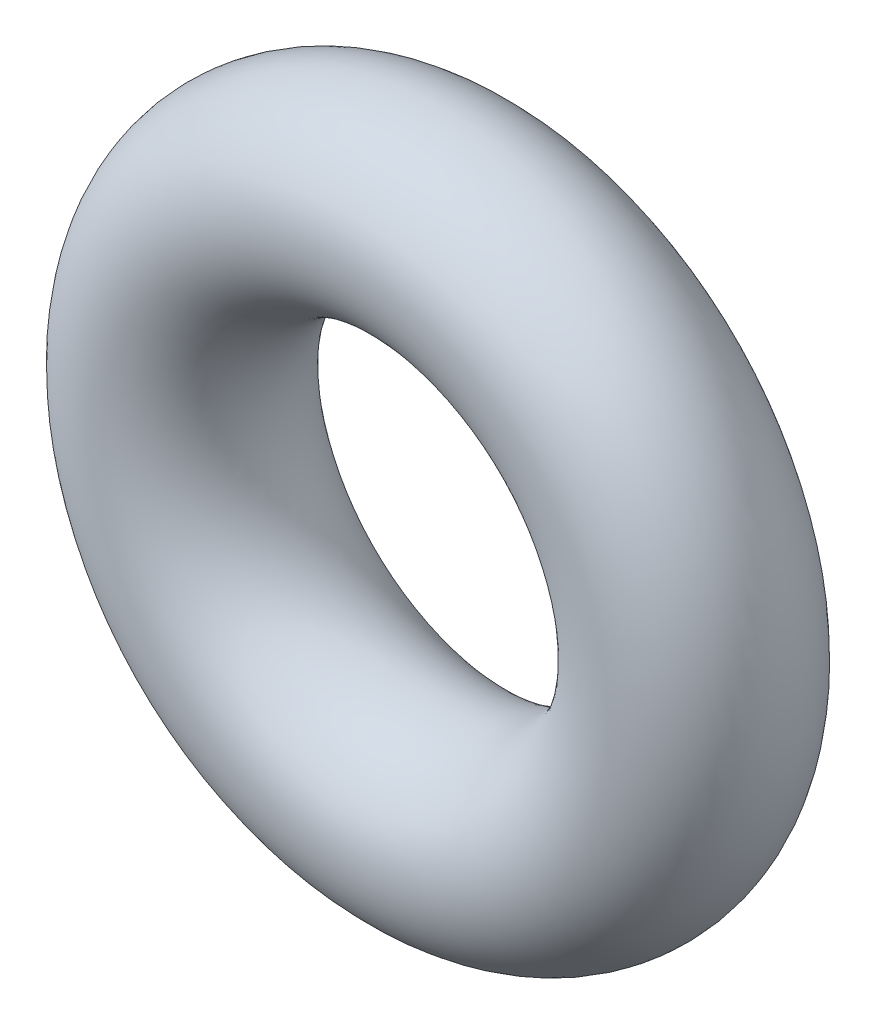
ISO-10303-21;
HEADER;
FILE_DESCRIPTION(('STEP AP214'),'2;1');
FILE_NAME('part.step','',(''),(''),'','','');
FILE_SCHEMA(('AUTOMOTIVE_DESIGN { 1 0 10303 214 1 1 1 1 }'));
ENDSEC;
DATA;
#1=APPLICATION_CONTEXT('core data for automotive mechanical design processes');
#2=APPLICATION_PROTOCOL_DEFINITION('international standard','automotive_design',2000,#1);
#3=PRODUCT_CONTEXT('',#1,'mechanical');
#4=PRODUCT('Part','Part','',(#3));
#5=PRODUCT_RELATED_PRODUCT_CATEGORY('part','',(#4));
#6=PRODUCT_DEFINITION_FORMATION('','',#4);
#7=PRODUCT_DEFINITION_CONTEXT('part definition',#1,'design');
#8=PRODUCT_DEFINITION('design','',#6,#7);
#9=PRODUCT_DEFINITION_SHAPE('','',#8);
#10=(LENGTH_UNIT() NAMED_UNIT(*) SI_UNIT(.MILLI.,.METRE.));
#11=(NAMED_UNIT(*) PLANE_ANGLE_UNIT() SI_UNIT($,.RADIAN.));
#12=(NAMED_UNIT(*) SI_UNIT($,.STERADIAN.) SOLID_ANGLE_UNIT());
#13=UNCERTAINTY_MEASURE_WITH_UNIT(LENGTH_MEASURE(1.E-05),#10,'distance_accuracy_value','');
#14=(GEOMETRIC_REPRESENTATION_CONTEXT(3) GLOBAL_UNCERTAINTY_ASSIGNED_CONTEXT((#13)) GLOBAL_UNIT_ASSIGNED_CONTEXT((#10,
#11,#12)) REPRESENTATION_CONTEXT('',''));
#15=CARTESIAN_POINT('',(0.,0.,0.));
#16=DIRECTION('',(0.,0.,1.));
#17=DIRECTION('',(1.,0.,0.));
#18=AXIS2_PLACEMENT_3D('',#15,#16,#17);
#19=CARTESIAN_POINT('',(0.,0.,0.));
#20=DIRECTION('',(0.,0.,1.));
#21=DIRECTION('',(1.,0.,0.));
#22=AXIS2_PLACEMENT_3D('',#19,#20,#21);
#23=TOROIDAL_SURFACE('',#22,2.,0.75);
#24=CARTESIAN_POINT('',(2.75,0.,0.));
#25=VERTEX_POINT('',#24);
#26=VERTEX_LOOP('',#25);
#27=FACE_BOUND('',#26,.T.);
#28=ADVANCED_FACE('F31',(#27),#23,.T.);
#29=CLOSED_SHELL('',(#28));
#30=MANIFOLD_SOLID_BREP('B2',#29);
#31=ADVANCED_BREP_SHAPE_REPRESENTATION('',(#18,#30),#14);
#32=SHAPE_DEFINITION_REPRESENTATION(#9,#31);
ENDSEC;
END-ISO-10303-21;
